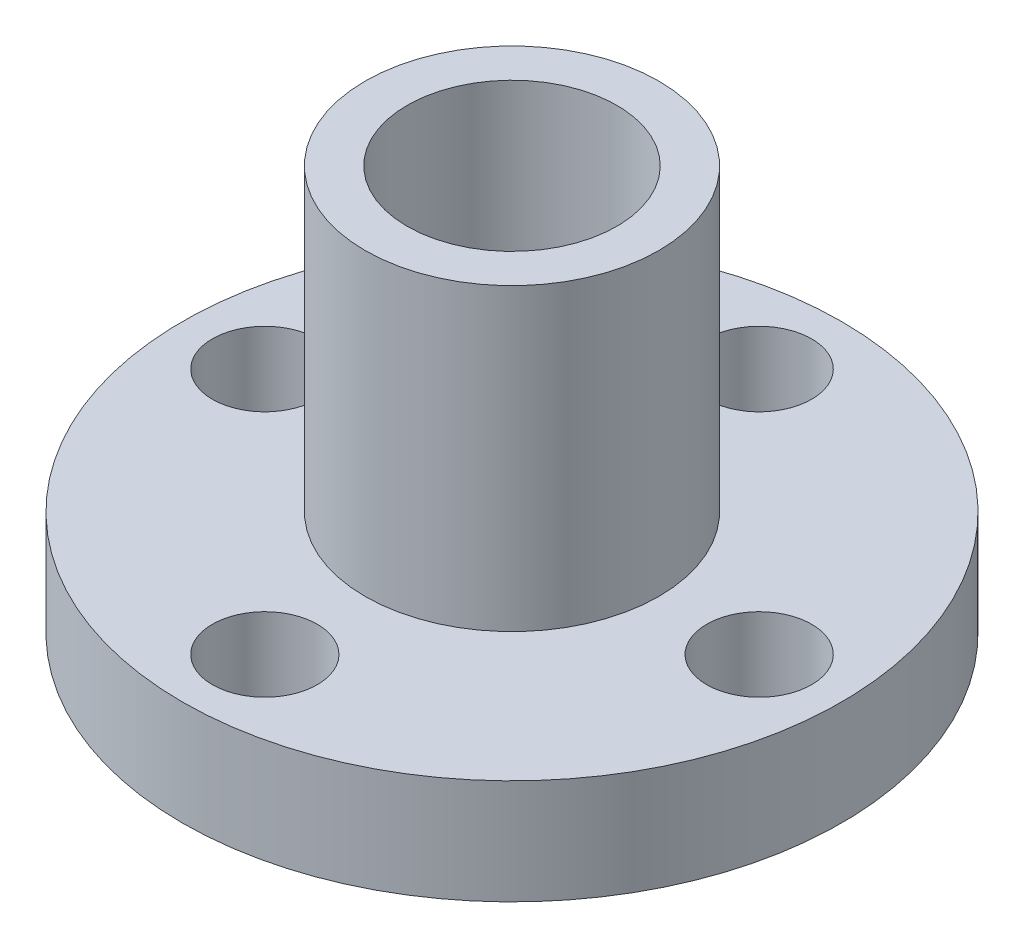
ISO-10303-21;
HEADER;
FILE_DESCRIPTION(('STEP AP214'),'2;1');
FILE_NAME('part.step','',(''),(''),'','','');
FILE_SCHEMA(('AUTOMOTIVE_DESIGN { 1 0 10303 214 1 1 1 1 }'));
ENDSEC;
DATA;
#1=APPLICATION_CONTEXT('core data for automotive mechanical design processes');
#2=APPLICATION_PROTOCOL_DEFINITION('international standard','automotive_design',2000,#1);
#3=PRODUCT_CONTEXT('',#1,'mechanical');
#4=PRODUCT('Part','Part','',(#3));
#5=PRODUCT_RELATED_PRODUCT_CATEGORY('part','',(#4));
#6=PRODUCT_DEFINITION_FORMATION('','',#4);
#7=PRODUCT_DEFINITION_CONTEXT('part definition',#1,'design');
#8=PRODUCT_DEFINITION('design','',#6,#7);
#9=PRODUCT_DEFINITION_SHAPE('','',#8);
#10=(LENGTH_UNIT() NAMED_UNIT(*) SI_UNIT(.MILLI.,.METRE.));
#11=(NAMED_UNIT(*) PLANE_ANGLE_UNIT() SI_UNIT($,.RADIAN.));
#12=(NAMED_UNIT(*) SI_UNIT($,.STERADIAN.) SOLID_ANGLE_UNIT());
#13=UNCERTAINTY_MEASURE_WITH_UNIT(LENGTH_MEASURE(1.E-05),#10,'distance_accuracy_value','');
#14=(GEOMETRIC_REPRESENTATION_CONTEXT(3) GLOBAL_UNCERTAINTY_ASSIGNED_CONTEXT((#13)) GLOBAL_UNIT_ASSIGNED_CONTEXT((#10,
#11,#12)) REPRESENTATION_CONTEXT('',''));
#15=CARTESIAN_POINT('',(0.,0.,0.));
#16=DIRECTION('',(0.,0.,1.));
#17=DIRECTION('',(1.,0.,0.));
#18=AXIS2_PLACEMENT_3D('',#15,#16,#17);
#19=CARTESIAN_POINT('',(0.,3.5,0.));
#20=DIRECTION('',(0.,1.,0.));
#21=DIRECTION('',(0.,0.,1.));
#22=AXIS2_PLACEMENT_3D('',#19,#20,#21);
#23=PLANE('',#22);
#24=CARTESIAN_POINT('',(-8.25,3.5,0.));
#25=DIRECTION('',(0.,1.,0.));
#26=DIRECTION('',(0.,0.,1.));
#27=AXIS2_PLACEMENT_3D('',#24,#25,#26);
#28=CIRCLE('',#27,1.75);
#29=CARTESIAN_POINT('',(-8.25,3.5,1.75));
#30=VERTEX_POINT('',#29);
#31=EDGE_CURVE('E100',#30,#30,#28,.T.);
#32=ORIENTED_EDGE('',*,*,#31,.F.);
#33=EDGE_LOOP('',(#32));
#34=FACE_BOUND('',#33,.T.);
#35=CARTESIAN_POINT('',(0.,3.5,8.25));
#36=DIRECTION('',(0.,1.,0.));
#37=DIRECTION('',(0.,0.,1.));
#38=AXIS2_PLACEMENT_3D('',#35,#36,#37);
#39=CIRCLE('',#38,1.75);
#40=CARTESIAN_POINT('',(0.,3.5,10.));
#41=VERTEX_POINT('',#40);
#42=EDGE_CURVE('E80',#41,#41,#39,.T.);
#43=ORIENTED_EDGE('',*,*,#42,.F.);
#44=EDGE_LOOP('',(#43));
#45=FACE_BOUND('',#44,.T.);
#46=CARTESIAN_POINT('',(0.,3.5,0.));
#47=DIRECTION('',(0.,1.,0.));
#48=DIRECTION('',(0.,0.,1.));
#49=AXIS2_PLACEMENT_3D('',#46,#47,#48);
#50=CIRCLE('',#49,11.);
#51=CARTESIAN_POINT('',(0.,3.5,11.));
#52=VERTEX_POINT('',#51);
#53=EDGE_CURVE('E11',#52,#52,#50,.T.);
#54=ORIENTED_EDGE('',*,*,#53,.T.);
#55=EDGE_LOOP('',(#54));
#56=FACE_BOUND('',#55,.T.);
#57=CARTESIAN_POINT('',(8.25,3.5,0.));
#58=DIRECTION('',(0.,1.,0.));
#59=DIRECTION('',(0.,0.,1.));
#60=AXIS2_PLACEMENT_3D('',#57,#58,#59);
#61=CIRCLE('',#60,1.75);
#62=CARTESIAN_POINT('',(8.25,3.5,1.75));
#63=VERTEX_POINT('',#62);
#64=EDGE_CURVE('E85',#63,#63,#61,.T.);
#65=ORIENTED_EDGE('',*,*,#64,.F.);
#66=EDGE_LOOP('',(#65));
#67=FACE_BOUND('',#66,.T.);
#68=CARTESIAN_POINT('',(0.,3.5,-8.25));
#69=DIRECTION('',(0.,1.,0.));
#70=DIRECTION('',(0.,0.,1.));
#71=AXIS2_PLACEMENT_3D('',#68,#69,#70);
#72=CIRCLE('',#71,1.75);
#73=CARTESIAN_POINT('',(0.,3.5,-6.5));
#74=VERTEX_POINT('',#73);
#75=EDGE_CURVE('E96',#74,#74,#72,.T.);
#76=ORIENTED_EDGE('',*,*,#75,.F.);
#77=EDGE_LOOP('',(#76));
#78=FACE_BOUND('',#77,.T.);
#79=CARTESIAN_POINT('',(0.,3.5,0.));
#80=DIRECTION('',(0.,1.,0.));
#81=DIRECTION('',(0.,0.,1.));
#82=AXIS2_PLACEMENT_3D('',#79,#80,#81);
#83=CIRCLE('',#82,4.9);
#84=CARTESIAN_POINT('',(0.,3.5,4.9));
#85=VERTEX_POINT('',#84);
#86=EDGE_CURVE('E109',#85,#85,#83,.T.);
#87=ORIENTED_EDGE('',*,*,#86,.F.);
#88=EDGE_LOOP('',(#87));
#89=FACE_BOUND('',#88,.T.);
#90=ADVANCED_FACE('F69',(#34,#45,#56,#67,#78,#89),#23,.T.);
#91=CARTESIAN_POINT('',(0.,0.,0.));
#92=DIRECTION('',(0.,1.,0.));
#93=DIRECTION('',(0.,0.,1.));
#94=AXIS2_PLACEMENT_3D('',#91,#92,#93);
#95=PLANE('',#94);
#96=CARTESIAN_POINT('',(0.,0.,0.));
#97=DIRECTION('',(0.,1.,0.));
#98=DIRECTION('',(0.,0.,1.));
#99=AXIS2_PLACEMENT_3D('',#96,#97,#98);
#100=CIRCLE('',#99,11.);
#101=CARTESIAN_POINT('',(0.,0.,11.));
#102=VERTEX_POINT('',#101);
#103=EDGE_CURVE('E73',#102,#102,#100,.T.);
#104=ORIENTED_EDGE('',*,*,#103,.F.);
#105=EDGE_LOOP('',(#104));
#106=FACE_BOUND('',#105,.T.);
#107=CARTESIAN_POINT('',(0.,0.,8.25));
#108=DIRECTION('',(0.,1.,0.));
#109=DIRECTION('',(0.,0.,1.));
#110=AXIS2_PLACEMENT_3D('',#107,#108,#109);
#111=CIRCLE('',#110,1.75);
#112=CARTESIAN_POINT('',(0.,0.,10.));
#113=VERTEX_POINT('',#112);
#114=EDGE_CURVE('E82',#113,#113,#111,.T.);
#115=ORIENTED_EDGE('',*,*,#114,.T.);
#116=EDGE_LOOP('',(#115));
#117=FACE_BOUND('',#116,.T.);
#118=CARTESIAN_POINT('',(8.25,0.,0.));
#119=DIRECTION('',(0.,1.,0.));
#120=DIRECTION('',(0.,0.,1.));
#121=AXIS2_PLACEMENT_3D('',#118,#119,#120);
#122=CIRCLE('',#121,1.75);
#123=CARTESIAN_POINT('',(8.25,0.,1.75));
#124=VERTEX_POINT('',#123);
#125=EDGE_CURVE('E88',#124,#124,#122,.T.);
#126=ORIENTED_EDGE('',*,*,#125,.T.);
#127=EDGE_LOOP('',(#126));
#128=FACE_BOUND('',#127,.T.);
#129=CARTESIAN_POINT('',(0.,0.,0.));
#130=DIRECTION('',(0.,1.,0.));
#131=DIRECTION('',(0.,0.,1.));
#132=AXIS2_PLACEMENT_3D('',#129,#130,#131);
#133=CIRCLE('',#132,3.5);
#134=CARTESIAN_POINT('',(0.,0.,3.5));
#135=VERTEX_POINT('',#134);
#136=EDGE_CURVE('E91',#135,#135,#133,.T.);
#137=ORIENTED_EDGE('',*,*,#136,.T.);
#138=EDGE_LOOP('',(#137));
#139=FACE_BOUND('',#138,.T.);
#140=CARTESIAN_POINT('',(0.,0.,-8.25));
#141=DIRECTION('',(0.,1.,0.));
#142=DIRECTION('',(0.,0.,1.));
#143=AXIS2_PLACEMENT_3D('',#140,#141,#142);
#144=CIRCLE('',#143,1.75);
#145=CARTESIAN_POINT('',(0.,0.,-6.5));
#146=VERTEX_POINT('',#145);
#147=EDGE_CURVE('E97',#146,#146,#144,.T.);
#148=ORIENTED_EDGE('',*,*,#147,.T.);
#149=EDGE_LOOP('',(#148));
#150=FACE_BOUND('',#149,.T.);
#151=CARTESIAN_POINT('',(-8.25,0.,0.));
#152=DIRECTION('',(0.,1.,0.));
#153=DIRECTION('',(0.,0.,1.));
#154=AXIS2_PLACEMENT_3D('',#151,#152,#153);
#155=CIRCLE('',#154,1.75);
#156=CARTESIAN_POINT('',(-8.25,0.,1.75));
#157=VERTEX_POINT('',#156);
#158=EDGE_CURVE('E103',#157,#157,#155,.T.);
#159=ORIENTED_EDGE('',*,*,#158,.T.);
#160=EDGE_LOOP('',(#159));
#161=FACE_BOUND('',#160,.T.);
#162=ADVANCED_FACE('F137',(#106,#117,#128,#139,#150,#161),#95,.F.);
#163=CARTESIAN_POINT('',(0.,3.5,0.));
#164=DIRECTION('',(0.,-1.,0.));
#165=DIRECTION('',(0.,0.,-1.));
#166=AXIS2_PLACEMENT_3D('',#163,#164,#165);
#167=CYLINDRICAL_SURFACE('',#166,11.);
#168=ORIENTED_EDGE('',*,*,#53,.F.);
#169=EDGE_LOOP('',(#168));
#170=FACE_BOUND('',#169,.T.);
#171=ORIENTED_EDGE('',*,*,#103,.T.);
#172=EDGE_LOOP('',(#171));
#173=FACE_BOUND('',#172,.T.);
#174=ADVANCED_FACE('F71',(#170,#173),#167,.T.);
#175=CARTESIAN_POINT('',(0.,3.5,8.25));
#176=DIRECTION('',(0.,-1.,0.));
#177=DIRECTION('',(0.,0.,-1.));
#178=AXIS2_PLACEMENT_3D('',#175,#176,#177);
#179=CYLINDRICAL_SURFACE('',#178,1.75);
#180=ORIENTED_EDGE('',*,*,#42,.T.);
#181=EDGE_LOOP('',(#180));
#182=FACE_BOUND('',#181,.T.);
#183=ORIENTED_EDGE('',*,*,#114,.F.);
#184=EDGE_LOOP('',(#183));
#185=FACE_BOUND('',#184,.T.);
#186=ADVANCED_FACE('F147',(#182,#185),#179,.F.);
#187=CARTESIAN_POINT('',(8.25,3.5,0.));
#188=DIRECTION('',(0.,-1.,0.));
#189=DIRECTION('',(0.,0.,-1.));
#190=AXIS2_PLACEMENT_3D('',#187,#188,#189);
#191=CYLINDRICAL_SURFACE('',#190,1.75);
#192=ORIENTED_EDGE('',*,*,#64,.T.);
#193=EDGE_LOOP('',(#192));
#194=FACE_BOUND('',#193,.T.);
#195=ORIENTED_EDGE('',*,*,#125,.F.);
#196=EDGE_LOOP('',(#195));
#197=FACE_BOUND('',#196,.T.);
#198=ADVANCED_FACE('F150',(#194,#197),#191,.F.);
#199=CARTESIAN_POINT('',(0.,3.5,0.));
#200=DIRECTION('',(0.,-1.,0.));
#201=DIRECTION('',(0.,0.,-1.));
#202=AXIS2_PLACEMENT_3D('',#199,#200,#201);
#203=CYLINDRICAL_SURFACE('',#202,3.5);
#204=ORIENTED_EDGE('',*,*,#136,.F.);
#205=EDGE_LOOP('',(#204));
#206=FACE_BOUND('',#205,.T.);
#207=CARTESIAN_POINT('',(0.,13.5,0.));
#208=DIRECTION('',(0.,1.,0.));
#209=DIRECTION('',(0.,0.,1.));
#210=AXIS2_PLACEMENT_3D('',#207,#208,#209);
#211=CIRCLE('',#210,3.5);
#212=CARTESIAN_POINT('',(0.,13.5,3.5));
#213=VERTEX_POINT('',#212);
#214=EDGE_CURVE('E112',#213,#213,#211,.T.);
#215=ORIENTED_EDGE('',*,*,#214,.T.);
#216=EDGE_LOOP('',(#215));
#217=FACE_BOUND('',#216,.T.);
#218=ADVANCED_FACE('F118',(#206,#217),#203,.F.);
#219=CARTESIAN_POINT('',(0.,3.5,-8.25));
#220=DIRECTION('',(0.,-1.,0.));
#221=DIRECTION('',(0.,0.,-1.));
#222=AXIS2_PLACEMENT_3D('',#219,#220,#221);
#223=CYLINDRICAL_SURFACE('',#222,1.75);
#224=ORIENTED_EDGE('',*,*,#75,.T.);
#225=EDGE_LOOP('',(#224));
#226=FACE_BOUND('',#225,.T.);
#227=ORIENTED_EDGE('',*,*,#147,.F.);
#228=EDGE_LOOP('',(#227));
#229=FACE_BOUND('',#228,.T.);
#230=ADVANCED_FACE('F133',(#226,#229),#223,.F.);
#231=CARTESIAN_POINT('',(-8.25,3.5,0.));
#232=DIRECTION('',(0.,-1.,0.));
#233=DIRECTION('',(0.,0.,-1.));
#234=AXIS2_PLACEMENT_3D('',#231,#232,#233);
#235=CYLINDRICAL_SURFACE('',#234,1.75);
#236=ORIENTED_EDGE('',*,*,#31,.T.);
#237=EDGE_LOOP('',(#236));
#238=FACE_BOUND('',#237,.T.);
#239=ORIENTED_EDGE('',*,*,#158,.F.);
#240=EDGE_LOOP('',(#239));
#241=FACE_BOUND('',#240,.T.);
#242=ADVANCED_FACE('F123',(#238,#241),#235,.F.);
#243=CARTESIAN_POINT('',(0.,13.5,0.));
#244=DIRECTION('',(0.,1.,0.));
#245=DIRECTION('',(0.,0.,1.));
#246=AXIS2_PLACEMENT_3D('',#243,#244,#245);
#247=PLANE('',#246);
#248=CARTESIAN_POINT('',(0.,13.5,0.));
#249=DIRECTION('',(0.,1.,0.));
#250=DIRECTION('',(0.,0.,1.));
#251=AXIS2_PLACEMENT_3D('',#248,#249,#250);
#252=CIRCLE('',#251,4.9);
#253=CARTESIAN_POINT('',(0.,13.5,4.9));
#254=VERTEX_POINT('',#253);
#255=EDGE_CURVE('E106',#254,#254,#252,.T.);
#256=ORIENTED_EDGE('',*,*,#255,.T.);
#257=EDGE_LOOP('',(#256));
#258=FACE_BOUND('',#257,.T.);
#259=ORIENTED_EDGE('',*,*,#214,.F.);
#260=EDGE_LOOP('',(#259));
#261=FACE_BOUND('',#260,.T.);
#262=ADVANCED_FACE('F120',(#258,#261),#247,.T.);
#263=CARTESIAN_POINT('',(0.,13.5,0.));
#264=DIRECTION('',(0.,-1.,0.));
#265=DIRECTION('',(0.,0.,-1.));
#266=AXIS2_PLACEMENT_3D('',#263,#264,#265);
#267=CYLINDRICAL_SURFACE('',#266,4.9);
#268=ORIENTED_EDGE('',*,*,#255,.F.);
#269=EDGE_LOOP('',(#268));
#270=FACE_BOUND('',#269,.T.);
#271=ORIENTED_EDGE('',*,*,#86,.T.);
#272=EDGE_LOOP('',(#271));
#273=FACE_BOUND('',#272,.T.);
#274=ADVANCED_FACE('F122',(#270,#273),#267,.T.);
#275=CLOSED_SHELL('',(#90,#162,#174,#186,#198,#218,#230,#242,#262,#274));
#276=MANIFOLD_SOLID_BREP('B2',#275);
#277=ADVANCED_BREP_SHAPE_REPRESENTATION('',(#18,#276),#14);
#278=SHAPE_DEFINITION_REPRESENTATION(#9,#277);
ENDSEC;
END-ISO-10303-21;
